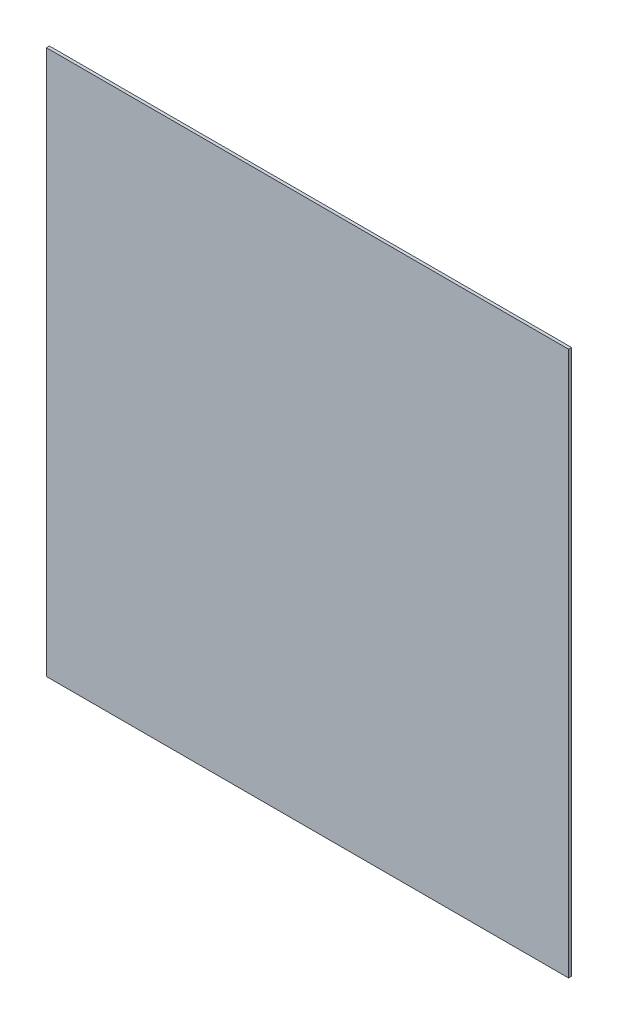
ISO-10303-21;
HEADER;
FILE_DESCRIPTION(('STEP AP214'),'2;1');
FILE_NAME('part.step','',(''),(''),'','','');
FILE_SCHEMA(('AUTOMOTIVE_DESIGN { 1 0 10303 214 1 1 1 1 }'));
ENDSEC;
DATA;
#1=APPLICATION_CONTEXT('core data for automotive mechanical design processes');
#2=APPLICATION_PROTOCOL_DEFINITION('international standard','automotive_design',2000,#1);
#3=PRODUCT_CONTEXT('',#1,'mechanical');
#4=PRODUCT('Part','Part','',(#3));
#5=PRODUCT_RELATED_PRODUCT_CATEGORY('part','',(#4));
#6=PRODUCT_DEFINITION_FORMATION('','',#4);
#7=PRODUCT_DEFINITION_CONTEXT('part definition',#1,'design');
#8=PRODUCT_DEFINITION('design','',#6,#7);
#9=PRODUCT_DEFINITION_SHAPE('','',#8);
#10=(LENGTH_UNIT() NAMED_UNIT(*) SI_UNIT(.MILLI.,.METRE.));
#11=(NAMED_UNIT(*) PLANE_ANGLE_UNIT() SI_UNIT($,.RADIAN.));
#12=(NAMED_UNIT(*) SI_UNIT($,.STERADIAN.) SOLID_ANGLE_UNIT());
#13=UNCERTAINTY_MEASURE_WITH_UNIT(LENGTH_MEASURE(1.E-05),#10,'distance_accuracy_value','');
#14=(GEOMETRIC_REPRESENTATION_CONTEXT(3) GLOBAL_UNCERTAINTY_ASSIGNED_CONTEXT((#13)) GLOBAL_UNIT_ASSIGNED_CONTEXT((#10,
#11,#12)) REPRESENTATION_CONTEXT('',''));
#15=CARTESIAN_POINT('',(0.,0.,0.));
#16=DIRECTION('',(0.,0.,1.));
#17=DIRECTION('',(1.,0.,0.));
#18=AXIS2_PLACEMENT_3D('',#15,#16,#17);
#19=CARTESIAN_POINT('',(436.25,-455.,5.));
#20=DIRECTION('',(-1.,0.,0.));
#21=DIRECTION('',(0.,0.,1.));
#22=AXIS2_PLACEMENT_3D('',#19,#20,#21);
#23=PLANE('',#22);
#24=DIRECTION('',(0.,1.,0.));
#25=VECTOR('',#24,1.);
#26=CARTESIAN_POINT('',(436.25,-455.,0.));
#27=LINE('',#26,#25);
#28=CARTESIAN_POINT('',(436.25,-455.,0.));
#29=VERTEX_POINT('',#28);
#30=CARTESIAN_POINT('',(436.25,455.,0.));
#31=VERTEX_POINT('',#30);
#32=EDGE_CURVE('E96',#29,#31,#27,.T.);
#33=ORIENTED_EDGE('',*,*,#32,.T.);
#34=DIRECTION('',(0.,0.,-1.));
#35=VECTOR('',#34,1.);
#36=CARTESIAN_POINT('',(436.25,455.,5.));
#37=LINE('',#36,#35);
#38=CARTESIAN_POINT('',(436.25,455.,5.));
#39=VERTEX_POINT('',#38);
#40=EDGE_CURVE('E11',#39,#31,#37,.T.);
#41=ORIENTED_EDGE('',*,*,#40,.F.);
#42=DIRECTION('',(0.,1.,0.));
#43=VECTOR('',#42,1.);
#44=CARTESIAN_POINT('',(436.25,-455.,5.));
#45=LINE('',#44,#43);
#46=CARTESIAN_POINT('',(436.25,-455.,5.));
#47=VERTEX_POINT('',#46);
#48=EDGE_CURVE('E84',#47,#39,#45,.T.);
#49=ORIENTED_EDGE('',*,*,#48,.F.);
#50=DIRECTION('',(0.,0.,-1.));
#51=VECTOR('',#50,1.);
#52=CARTESIAN_POINT('',(436.25,-455.,5.));
#53=LINE('',#52,#51);
#54=EDGE_CURVE('E92',#47,#29,#53,.T.);
#55=ORIENTED_EDGE('',*,*,#54,.T.);
#56=EDGE_LOOP('',(#33,#41,#49,#55));
#57=FACE_BOUND('',#56,.T.);
#58=ADVANCED_FACE('F33',(#57),#23,.F.);
#59=CARTESIAN_POINT('',(-436.25,455.,5.));
#60=DIRECTION('',(0.,-1.,0.));
#61=DIRECTION('',(0.,0.,-1.));
#62=AXIS2_PLACEMENT_3D('',#59,#60,#61);
#63=PLANE('',#62);
#64=DIRECTION('',(-1.,0.,0.));
#65=VECTOR('',#64,1.);
#66=CARTESIAN_POINT('',(-436.25,455.,0.));
#67=LINE('',#66,#65);
#68=CARTESIAN_POINT('',(-436.25,455.,0.));
#69=VERTEX_POINT('',#68);
#70=EDGE_CURVE('E88',#31,#69,#67,.T.);
#71=ORIENTED_EDGE('',*,*,#70,.T.);
#72=DIRECTION('',(0.,0.,-1.));
#73=VECTOR('',#72,1.);
#74=CARTESIAN_POINT('',(-436.25,455.,5.));
#75=LINE('',#74,#73);
#76=CARTESIAN_POINT('',(-436.25,455.,5.));
#77=VERTEX_POINT('',#76);
#78=EDGE_CURVE('E41',#77,#69,#75,.T.);
#79=ORIENTED_EDGE('',*,*,#78,.F.);
#80=DIRECTION('',(-1.,0.,0.));
#81=VECTOR('',#80,1.);
#82=CARTESIAN_POINT('',(-436.25,455.,5.));
#83=LINE('',#82,#81);
#84=EDGE_CURVE('E79',#39,#77,#83,.T.);
#85=ORIENTED_EDGE('',*,*,#84,.F.);
#86=ORIENTED_EDGE('',*,*,#40,.T.);
#87=EDGE_LOOP('',(#71,#79,#85,#86));
#88=FACE_BOUND('',#87,.T.);
#89=ADVANCED_FACE('F87',(#88),#63,.F.);
#90=CARTESIAN_POINT('',(-436.25,-455.,5.));
#91=DIRECTION('',(1.,0.,0.));
#92=DIRECTION('',(0.,0.,-1.));
#93=AXIS2_PLACEMENT_3D('',#90,#91,#92);
#94=PLANE('',#93);
#95=DIRECTION('',(0.,-1.,0.));
#96=VECTOR('',#95,1.);
#97=CARTESIAN_POINT('',(-436.25,-455.,0.));
#98=LINE('',#97,#96);
#99=CARTESIAN_POINT('',(-436.25,-455.,0.));
#100=VERTEX_POINT('',#99);
#101=EDGE_CURVE('E66',#69,#100,#98,.T.);
#102=ORIENTED_EDGE('',*,*,#101,.T.);
#103=DIRECTION('',(0.,0.,-1.));
#104=VECTOR('',#103,1.);
#105=CARTESIAN_POINT('',(-436.25,-455.,5.));
#106=LINE('',#105,#104);
#107=CARTESIAN_POINT('',(-436.25,-455.,5.));
#108=VERTEX_POINT('',#107);
#109=EDGE_CURVE('E89',#108,#100,#106,.T.);
#110=ORIENTED_EDGE('',*,*,#109,.F.);
#111=DIRECTION('',(0.,-1.,0.));
#112=VECTOR('',#111,1.);
#113=CARTESIAN_POINT('',(-436.25,-455.,5.));
#114=LINE('',#113,#112);
#115=EDGE_CURVE('E82',#77,#108,#114,.T.);
#116=ORIENTED_EDGE('',*,*,#115,.F.);
#117=ORIENTED_EDGE('',*,*,#78,.T.);
#118=EDGE_LOOP('',(#102,#110,#116,#117));
#119=FACE_BOUND('',#118,.T.);
#120=ADVANCED_FACE('F90',(#119),#94,.F.);
#121=CARTESIAN_POINT('',(-436.25,-455.,5.));
#122=DIRECTION('',(0.,1.,0.));
#123=DIRECTION('',(0.,0.,1.));
#124=AXIS2_PLACEMENT_3D('',#121,#122,#123);
#125=PLANE('',#124);
#126=DIRECTION('',(1.,0.,0.));
#127=VECTOR('',#126,1.);
#128=CARTESIAN_POINT('',(-436.25,-455.,0.));
#129=LINE('',#128,#127);
#130=EDGE_CURVE('E72',#100,#29,#129,.T.);
#131=ORIENTED_EDGE('',*,*,#130,.T.);
#132=ORIENTED_EDGE('',*,*,#54,.F.);
#133=DIRECTION('',(1.,0.,0.));
#134=VECTOR('',#133,1.);
#135=CARTESIAN_POINT('',(-436.25,-455.,5.));
#136=LINE('',#135,#134);
#137=EDGE_CURVE('E49',#108,#47,#136,.T.);
#138=ORIENTED_EDGE('',*,*,#137,.F.);
#139=ORIENTED_EDGE('',*,*,#109,.T.);
#140=EDGE_LOOP('',(#131,#132,#138,#139));
#141=FACE_BOUND('',#140,.T.);
#142=ADVANCED_FACE('F103',(#141),#125,.F.);
#143=CARTESIAN_POINT('',(0.,0.,5.));
#144=DIRECTION('',(0.,0.,-1.));
#145=DIRECTION('',(-1.,0.,0.));
#146=AXIS2_PLACEMENT_3D('',#143,#144,#145);
#147=PLANE('',#146);
#148=ORIENTED_EDGE('',*,*,#48,.T.);
#149=ORIENTED_EDGE('',*,*,#84,.T.);
#150=ORIENTED_EDGE('',*,*,#115,.T.);
#151=ORIENTED_EDGE('',*,*,#137,.T.);
#152=EDGE_LOOP('',(#148,#149,#150,#151));
#153=FACE_BOUND('',#152,.T.);
#154=ADVANCED_FACE('F80',(#153),#147,.F.);
#155=CARTESIAN_POINT('',(0.,0.,0.));
#156=DIRECTION('',(0.,0.,-1.));
#157=DIRECTION('',(-1.,0.,0.));
#158=AXIS2_PLACEMENT_3D('',#155,#156,#157);
#159=PLANE('',#158);
#160=ORIENTED_EDGE('',*,*,#32,.F.);
#161=ORIENTED_EDGE('',*,*,#130,.F.);
#162=ORIENTED_EDGE('',*,*,#101,.F.);
#163=ORIENTED_EDGE('',*,*,#70,.F.);
#164=EDGE_LOOP('',(#160,#161,#162,#163));
#165=FACE_BOUND('',#164,.T.);
#166=ADVANCED_FACE('F106',(#165),#159,.T.);
#167=CLOSED_SHELL('',(#58,#89,#120,#142,#154,#166));
#168=MANIFOLD_SOLID_BREP('B2',#167);
#169=ADVANCED_BREP_SHAPE_REPRESENTATION('',(#18,#168),#14);
#170=SHAPE_DEFINITION_REPRESENTATION(#9,#169);
ENDSEC;
END-ISO-10303-21;
